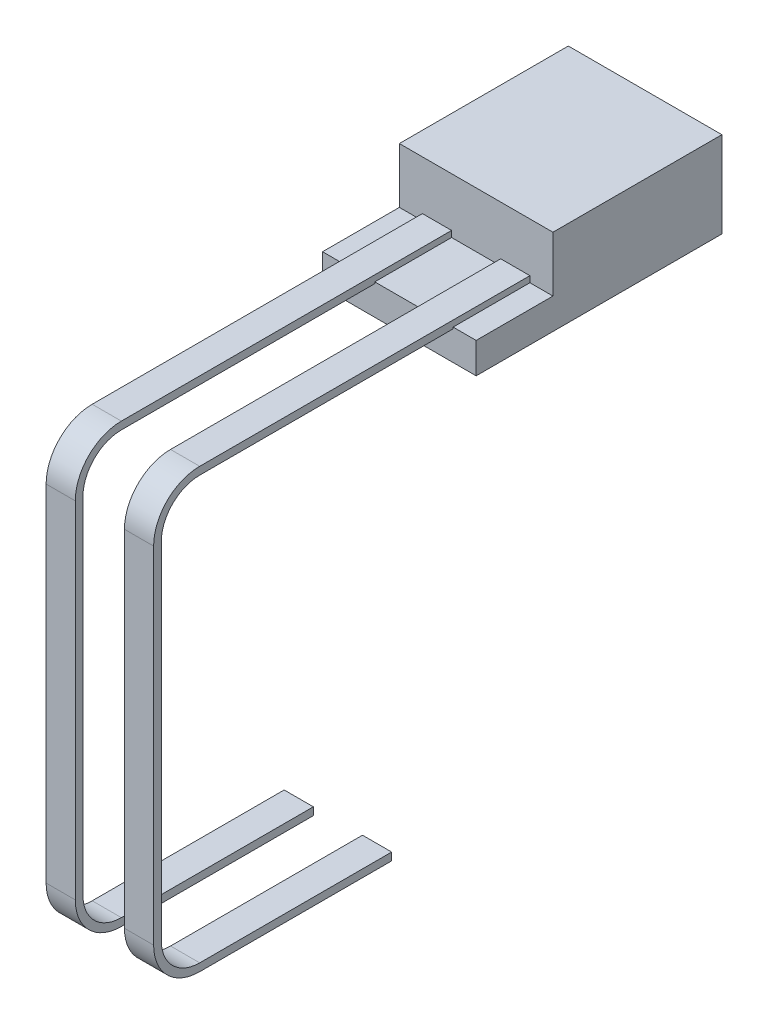
ISO-10303-21;
HEADER;
FILE_DESCRIPTION(('STEP AP214'),'2;1');
FILE_NAME('part.step','',(''),(''),'','','');
FILE_SCHEMA(('AUTOMOTIVE_DESIGN { 1 0 10303 214 1 1 1 1 }'));
ENDSEC;
DATA;
#1=APPLICATION_CONTEXT('core data for automotive mechanical design processes');
#2=APPLICATION_PROTOCOL_DEFINITION('international standard','automotive_design',2000,#1);
#3=PRODUCT_CONTEXT('',#1,'mechanical');
#4=PRODUCT('Part','Part','',(#3));
#5=PRODUCT_RELATED_PRODUCT_CATEGORY('part','',(#4));
#6=PRODUCT_DEFINITION_FORMATION('','',#4);
#7=PRODUCT_DEFINITION_CONTEXT('part definition',#1,'design');
#8=PRODUCT_DEFINITION('design','',#6,#7);
#9=PRODUCT_DEFINITION_SHAPE('','',#8);
#10=(LENGTH_UNIT() NAMED_UNIT(*) SI_UNIT(.MILLI.,.METRE.));
#11=(NAMED_UNIT(*) PLANE_ANGLE_UNIT() SI_UNIT($,.RADIAN.));
#12=(NAMED_UNIT(*) SI_UNIT($,.STERADIAN.) SOLID_ANGLE_UNIT());
#13=UNCERTAINTY_MEASURE_WITH_UNIT(LENGTH_MEASURE(1.E-05),#10,'distance_accuracy_value','');
#14=(GEOMETRIC_REPRESENTATION_CONTEXT(3) GLOBAL_UNCERTAINTY_ASSIGNED_CONTEXT((#13)) GLOBAL_UNIT_ASSIGNED_CONTEXT((#10,
#11,#12)) REPRESENTATION_CONTEXT('',''));
#15=CARTESIAN_POINT('',(0.,0.,0.));
#16=DIRECTION('',(0.,0.,1.));
#17=DIRECTION('',(1.,0.,0.));
#18=AXIS2_PLACEMENT_3D('',#15,#16,#17);
#19=CARTESIAN_POINT('',(-5.,0.4,3.63381681835357));
#20=DIRECTION('',(0.,-1.,0.));
#21=DIRECTION('',(0.,0.,-1.));
#22=AXIS2_PLACEMENT_3D('',#19,#20,#21);
#23=PLANE('',#22);
#24=DIRECTION('',(1.,0.,0.));
#25=VECTOR('',#24,1.);
#26=CARTESIAN_POINT('',(-5.,0.4,2.2));
#27=LINE('',#26,#25);
#28=CARTESIAN_POINT('',(-0.32,0.4,2.2));
#29=VERTEX_POINT('',#28);
#30=CARTESIAN_POINT('',(0.32,0.4,2.2));
#31=VERTEX_POINT('',#30);
#32=EDGE_CURVE('E486',#29,#31,#27,.T.);
#33=ORIENTED_EDGE('',*,*,#32,.F.);
#34=DIRECTION('',(0.,0.,1.));
#35=VECTOR('',#34,1.);
#36=CARTESIAN_POINT('',(-0.32,0.4,3.63381681835357));
#37=LINE('',#36,#35);
#38=CARTESIAN_POINT('',(-0.32,0.4,3.2));
#39=VERTEX_POINT('',#38);
#40=EDGE_CURVE('E362',#29,#39,#37,.T.);
#41=ORIENTED_EDGE('',*,*,#40,.T.);
#42=DIRECTION('',(-1.,0.,0.));
#43=VECTOR('',#42,1.);
#44=CARTESIAN_POINT('',(-1.,0.4,3.2));
#45=LINE('',#44,#43);
#46=CARTESIAN_POINT('',(0.32,0.4,3.2));
#47=VERTEX_POINT('',#46);
#48=EDGE_CURVE('E497',#47,#39,#45,.T.);
#49=ORIENTED_EDGE('',*,*,#48,.F.);
#50=DIRECTION('',(0.,0.,1.));
#51=VECTOR('',#50,1.);
#52=CARTESIAN_POINT('',(0.32,0.4,3.63381681835357));
#53=LINE('',#52,#51);
#54=EDGE_CURVE('E476',#31,#47,#53,.T.);
#55=ORIENTED_EDGE('',*,*,#54,.F.);
#56=EDGE_LOOP('',(#33,#41,#49,#55));
#57=FACE_BOUND('',#56,.T.);
#58=ADVANCED_FACE('F33',(#57),#23,.F.);
#59=CARTESIAN_POINT('',(-1.,1.12,3.2));
#60=DIRECTION('',(0.,0.,-1.));
#61=DIRECTION('',(-1.,0.,0.));
#62=AXIS2_PLACEMENT_3D('',#59,#60,#61);
#63=PLANE('',#62);
#64=ORIENTED_EDGE('',*,*,#48,.T.);
#65=DIRECTION('',(0.,-1.,0.));
#66=VECTOR('',#65,1.);
#67=CARTESIAN_POINT('',(-0.32,1.12,3.2));
#68=LINE('',#67,#66);
#69=CARTESIAN_POINT('',(-0.32,0.38,3.2));
#70=VERTEX_POINT('',#69);
#71=EDGE_CURVE('E365',#39,#70,#68,.T.);
#72=ORIENTED_EDGE('',*,*,#71,.T.);
#73=DIRECTION('',(-1.,0.,0.));
#74=VECTOR('',#73,1.);
#75=CARTESIAN_POINT('',(-1.,0.38,3.2));
#76=LINE('',#75,#74);
#77=CARTESIAN_POINT('',(-0.7,0.38,3.2));
#78=VERTEX_POINT('',#77);
#79=EDGE_CURVE('E11',#70,#78,#76,.T.);
#80=ORIENTED_EDGE('',*,*,#79,.T.);
#81=DIRECTION('',(0.,1.,0.));
#82=VECTOR('',#81,1.);
#83=CARTESIAN_POINT('',(-0.7,1.12,3.2));
#84=LINE('',#83,#82);
#85=CARTESIAN_POINT('',(-0.7,0.4,3.2));
#86=VERTEX_POINT('',#85);
#87=EDGE_CURVE('E359',#78,#86,#84,.T.);
#88=ORIENTED_EDGE('',*,*,#87,.T.);
#89=CARTESIAN_POINT('',(-1.,0.4,3.2));
#90=VERTEX_POINT('',#89);
#91=EDGE_CURVE('E492',#86,#90,#45,.T.);
#92=ORIENTED_EDGE('',*,*,#91,.T.);
#93=DIRECTION('',(0.,-1.,0.));
#94=VECTOR('',#93,1.);
#95=CARTESIAN_POINT('',(-1.,1.12,3.2));
#96=LINE('',#95,#94);
#97=CARTESIAN_POINT('',(-1.,0.,3.2));
#98=VERTEX_POINT('',#97);
#99=EDGE_CURVE('E525',#90,#98,#96,.T.);
#100=ORIENTED_EDGE('',*,*,#99,.T.);
#101=DIRECTION('',(1.,0.,0.));
#102=VECTOR('',#101,1.);
#103=CARTESIAN_POINT('',(-1.,0.,3.2));
#104=LINE('',#103,#102);
#105=CARTESIAN_POINT('',(1.,0.,3.2));
#106=VERTEX_POINT('',#105);
#107=EDGE_CURVE('E512',#98,#106,#104,.T.);
#108=ORIENTED_EDGE('',*,*,#107,.T.);
#109=DIRECTION('',(0.,-1.,0.));
#110=VECTOR('',#109,1.);
#111=CARTESIAN_POINT('',(1.,1.12,3.2));
#112=LINE('',#111,#110);
#113=CARTESIAN_POINT('',(1.,0.4,3.2));
#114=VERTEX_POINT('',#113);
#115=EDGE_CURVE('E523',#114,#106,#112,.T.);
#116=ORIENTED_EDGE('',*,*,#115,.F.);
#117=CARTESIAN_POINT('',(0.7,0.4,3.2));
#118=VERTEX_POINT('',#117);
#119=EDGE_CURVE('E493',#114,#118,#45,.T.);
#120=ORIENTED_EDGE('',*,*,#119,.T.);
#121=DIRECTION('',(0.,1.,0.));
#122=VECTOR('',#121,1.);
#123=CARTESIAN_POINT('',(0.7,1.12,3.2));
#124=LINE('',#123,#122);
#125=CARTESIAN_POINT('',(0.7,0.38,3.2));
#126=VERTEX_POINT('',#125);
#127=EDGE_CURVE('E473',#126,#118,#124,.T.);
#128=ORIENTED_EDGE('',*,*,#127,.F.);
#129=DIRECTION('',(1.,0.,0.));
#130=VECTOR('',#129,1.);
#131=CARTESIAN_POINT('',(-1.,0.38,3.2));
#132=LINE('',#131,#130);
#133=CARTESIAN_POINT('',(0.32,0.38,3.2));
#134=VERTEX_POINT('',#133);
#135=EDGE_CURVE('E56',#134,#126,#132,.T.);
#136=ORIENTED_EDGE('',*,*,#135,.F.);
#137=DIRECTION('',(0.,-1.,0.));
#138=VECTOR('',#137,1.);
#139=CARTESIAN_POINT('',(0.32,1.12,3.2));
#140=LINE('',#139,#138);
#141=EDGE_CURVE('E479',#47,#134,#140,.T.);
#142=ORIENTED_EDGE('',*,*,#141,.F.);
#143=EDGE_LOOP('',(#64,#72,#80,#88,#92,#100,#108,#116,#120,#128,#136,#142));
#144=FACE_BOUND('',#143,.T.);
#145=ADVANCED_FACE('F548',(#144),#63,.F.);
#146=ORIENTED_EDGE('',*,*,#91,.F.);
#147=DIRECTION('',(0.,0.,-1.));
#148=VECTOR('',#147,1.);
#149=CARTESIAN_POINT('',(-0.7,0.4,3.63381681835357));
#150=LINE('',#149,#148);
#151=CARTESIAN_POINT('',(-0.7,0.4,2.2));
#152=VERTEX_POINT('',#151);
#153=EDGE_CURVE('E356',#86,#152,#150,.T.);
#154=ORIENTED_EDGE('',*,*,#153,.T.);
#155=CARTESIAN_POINT('',(-1.,0.4,2.2));
#156=VERTEX_POINT('',#155);
#157=EDGE_CURVE('E482',#156,#152,#27,.T.);
#158=ORIENTED_EDGE('',*,*,#157,.F.);
#159=DIRECTION('',(0.,0.,-1.));
#160=VECTOR('',#159,1.);
#161=CARTESIAN_POINT('',(-1.,0.4,0.));
#162=LINE('',#161,#160);
#163=EDGE_CURVE('E496',#90,#156,#162,.T.);
#164=ORIENTED_EDGE('',*,*,#163,.F.);
#165=EDGE_LOOP('',(#146,#154,#158,#164));
#166=FACE_BOUND('',#165,.T.);
#167=ADVANCED_FACE('F543',(#166),#23,.F.);
#168=DIRECTION('',(0.,0.,-1.));
#169=VECTOR('',#168,1.);
#170=CARTESIAN_POINT('',(0.7,0.4,3.63381681835357));
#171=LINE('',#170,#169);
#172=CARTESIAN_POINT('',(0.7,0.4,2.2));
#173=VERTEX_POINT('',#172);
#174=EDGE_CURVE('E470',#118,#173,#171,.T.);
#175=ORIENTED_EDGE('',*,*,#174,.F.);
#176=ORIENTED_EDGE('',*,*,#119,.F.);
#177=DIRECTION('',(0.,0.,1.));
#178=VECTOR('',#177,1.);
#179=CARTESIAN_POINT('',(1.,0.4,0.));
#180=LINE('',#179,#178);
#181=CARTESIAN_POINT('',(1.,0.4,2.2));
#182=VERTEX_POINT('',#181);
#183=EDGE_CURVE('E529',#182,#114,#180,.T.);
#184=ORIENTED_EDGE('',*,*,#183,.F.);
#185=EDGE_CURVE('E481',#173,#182,#27,.T.);
#186=ORIENTED_EDGE('',*,*,#185,.F.);
#187=EDGE_LOOP('',(#175,#176,#184,#186));
#188=FACE_BOUND('',#187,.T.);
#189=ADVANCED_FACE('F565',(#188),#23,.F.);
#190=CARTESIAN_POINT('',(-5.,1.46500542852974,2.2));
#191=DIRECTION('',(0.,0.,-1.));
#192=DIRECTION('',(-1.,0.,0.));
#193=AXIS2_PLACEMENT_3D('',#190,#191,#192);
#194=PLANE('',#193);
#195=DIRECTION('',(1.,0.,0.));
#196=VECTOR('',#195,1.);
#197=CARTESIAN_POINT('',(-0.32,0.48,2.2));
#198=LINE('',#197,#196);
#199=CARTESIAN_POINT('',(-0.7,0.48,2.2));
#200=VERTEX_POINT('',#199);
#201=CARTESIAN_POINT('',(-0.32,0.48,2.2));
#202=VERTEX_POINT('',#201);
#203=EDGE_CURVE('E48',#200,#202,#198,.T.);
#204=ORIENTED_EDGE('',*,*,#203,.T.);
#205=DIRECTION('',(0.,-1.,0.));
#206=VECTOR('',#205,1.);
#207=CARTESIAN_POINT('',(-0.32,0.48,2.2));
#208=LINE('',#207,#206);
#209=EDGE_CURVE('E273',#202,#29,#208,.T.);
#210=ORIENTED_EDGE('',*,*,#209,.T.);
#211=ORIENTED_EDGE('',*,*,#32,.T.);
#212=DIRECTION('',(0.,-1.,0.));
#213=VECTOR('',#212,1.);
#214=CARTESIAN_POINT('',(0.32,0.48,2.2));
#215=LINE('',#214,#213);
#216=CARTESIAN_POINT('',(0.32,0.48,2.2));
#217=VERTEX_POINT('',#216);
#218=EDGE_CURVE('E368',#217,#31,#215,.T.);
#219=ORIENTED_EDGE('',*,*,#218,.F.);
#220=DIRECTION('',(-1.,0.,0.));
#221=VECTOR('',#220,1.);
#222=CARTESIAN_POINT('',(0.32,0.48,2.2));
#223=LINE('',#222,#221);
#224=CARTESIAN_POINT('',(0.7,0.48,2.2));
#225=VERTEX_POINT('',#224);
#226=EDGE_CURVE('E373',#225,#217,#223,.T.);
#227=ORIENTED_EDGE('',*,*,#226,.F.);
#228=DIRECTION('',(0.,1.,0.));
#229=VECTOR('',#228,1.);
#230=CARTESIAN_POINT('',(0.7,1.46500542852974,2.2));
#231=LINE('',#230,#229);
#232=EDGE_CURVE('E532',#173,#225,#231,.T.);
#233=ORIENTED_EDGE('',*,*,#232,.F.);
#234=ORIENTED_EDGE('',*,*,#185,.T.);
#235=DIRECTION('',(0.,-1.,0.));
#236=VECTOR('',#235,1.);
#237=CARTESIAN_POINT('',(1.,1.12,2.2));
#238=LINE('',#237,#236);
#239=CARTESIAN_POINT('',(1.,1.12,2.2));
#240=VERTEX_POINT('',#239);
#241=EDGE_CURVE('E485',#240,#182,#238,.T.);
#242=ORIENTED_EDGE('',*,*,#241,.F.);
#243=DIRECTION('',(-1.,0.,0.));
#244=VECTOR('',#243,1.);
#245=CARTESIAN_POINT('',(-1.,1.12,2.2));
#246=LINE('',#245,#244);
#247=CARTESIAN_POINT('',(-1.,1.12,2.2));
#248=VERTEX_POINT('',#247);
#249=EDGE_CURVE('E527',#240,#248,#246,.T.);
#250=ORIENTED_EDGE('',*,*,#249,.T.);
#251=DIRECTION('',(0.,1.,0.));
#252=VECTOR('',#251,1.);
#253=CARTESIAN_POINT('',(-1.,1.12,2.2));
#254=LINE('',#253,#252);
#255=EDGE_CURVE('E489',#156,#248,#254,.T.);
#256=ORIENTED_EDGE('',*,*,#255,.F.);
#257=ORIENTED_EDGE('',*,*,#157,.T.);
#258=DIRECTION('',(0.,1.,0.));
#259=VECTOR('',#258,1.);
#260=CARTESIAN_POINT('',(-0.7,1.46500542852974,2.2));
#261=LINE('',#260,#259);
#262=EDGE_CURVE('E41',#152,#200,#261,.T.);
#263=ORIENTED_EDGE('',*,*,#262,.T.);
#264=EDGE_LOOP('',(#204,#210,#211,#219,#227,#233,#234,#242,#250,#256,#257,#263));
#265=FACE_BOUND('',#264,.T.);
#266=ADVANCED_FACE('F537',(#265),#194,.F.);
#267=CARTESIAN_POINT('',(-1.,1.12,0.));
#268=DIRECTION('',(1.,0.,0.));
#269=DIRECTION('',(0.,0.,-1.));
#270=AXIS2_PLACEMENT_3D('',#267,#268,#269);
#271=PLANE('',#270);
#272=ORIENTED_EDGE('',*,*,#163,.T.);
#273=ORIENTED_EDGE('',*,*,#255,.T.);
#274=DIRECTION('',(0.,0.,1.));
#275=VECTOR('',#274,1.);
#276=CARTESIAN_POINT('',(-1.,1.12,0.));
#277=LINE('',#276,#275);
#278=CARTESIAN_POINT('',(-1.,1.12,0.));
#279=VERTEX_POINT('',#278);
#280=EDGE_CURVE('E501',#279,#248,#277,.T.);
#281=ORIENTED_EDGE('',*,*,#280,.F.);
#282=DIRECTION('',(0.,-1.,0.));
#283=VECTOR('',#282,1.);
#284=CARTESIAN_POINT('',(-1.,1.12,0.));
#285=LINE('',#284,#283);
#286=CARTESIAN_POINT('',(-1.,0.,0.));
#287=VERTEX_POINT('',#286);
#288=EDGE_CURVE('E509',#279,#287,#285,.T.);
#289=ORIENTED_EDGE('',*,*,#288,.T.);
#290=DIRECTION('',(0.,0.,1.));
#291=VECTOR('',#290,1.);
#292=CARTESIAN_POINT('',(-1.,0.,0.));
#293=LINE('',#292,#291);
#294=EDGE_CURVE('E500',#287,#98,#293,.T.);
#295=ORIENTED_EDGE('',*,*,#294,.T.);
#296=ORIENTED_EDGE('',*,*,#99,.F.);
#297=EDGE_LOOP('',(#272,#273,#281,#289,#295,#296));
#298=FACE_BOUND('',#297,.T.);
#299=ADVANCED_FACE('F35',(#298),#271,.F.);
#300=CARTESIAN_POINT('',(1.,1.12,0.));
#301=DIRECTION('',(-1.,0.,0.));
#302=DIRECTION('',(0.,0.,1.));
#303=AXIS2_PLACEMENT_3D('',#300,#301,#302);
#304=PLANE('',#303);
#305=DIRECTION('',(0.,0.,-1.));
#306=VECTOR('',#305,1.);
#307=CARTESIAN_POINT('',(1.,1.12,0.));
#308=LINE('',#307,#306);
#309=CARTESIAN_POINT('',(1.,1.12,0.));
#310=VERTEX_POINT('',#309);
#311=EDGE_CURVE('E504',#240,#310,#308,.T.);
#312=ORIENTED_EDGE('',*,*,#311,.F.);
#313=ORIENTED_EDGE('',*,*,#241,.T.);
#314=ORIENTED_EDGE('',*,*,#183,.T.);
#315=ORIENTED_EDGE('',*,*,#115,.T.);
#316=DIRECTION('',(0.,0.,-1.));
#317=VECTOR('',#316,1.);
#318=CARTESIAN_POINT('',(1.,0.,0.));
#319=LINE('',#318,#317);
#320=CARTESIAN_POINT('',(1.,0.,0.));
#321=VERTEX_POINT('',#320);
#322=EDGE_CURVE('E515',#106,#321,#319,.T.);
#323=ORIENTED_EDGE('',*,*,#322,.T.);
#324=DIRECTION('',(0.,-1.,0.));
#325=VECTOR('',#324,1.);
#326=CARTESIAN_POINT('',(1.,1.12,0.));
#327=LINE('',#326,#325);
#328=EDGE_CURVE('E520',#310,#321,#327,.T.);
#329=ORIENTED_EDGE('',*,*,#328,.F.);
#330=EDGE_LOOP('',(#312,#313,#314,#315,#323,#329));
#331=FACE_BOUND('',#330,.T.);
#332=ADVANCED_FACE('F569',(#331),#304,.F.);
#333=CARTESIAN_POINT('',(-1.,1.12,0.));
#334=DIRECTION('',(0.,0.,1.));
#335=DIRECTION('',(1.,0.,0.));
#336=AXIS2_PLACEMENT_3D('',#333,#334,#335);
#337=PLANE('',#336);
#338=DIRECTION('',(-1.,0.,0.));
#339=VECTOR('',#338,1.);
#340=CARTESIAN_POINT('',(-1.,0.,0.));
#341=LINE('',#340,#339);
#342=EDGE_CURVE('E505',#321,#287,#341,.T.);
#343=ORIENTED_EDGE('',*,*,#342,.T.);
#344=ORIENTED_EDGE('',*,*,#288,.F.);
#345=DIRECTION('',(-1.,0.,0.));
#346=VECTOR('',#345,1.);
#347=CARTESIAN_POINT('',(-1.,1.12,0.));
#348=LINE('',#347,#346);
#349=EDGE_CURVE('E507',#310,#279,#348,.T.);
#350=ORIENTED_EDGE('',*,*,#349,.F.);
#351=ORIENTED_EDGE('',*,*,#328,.T.);
#352=EDGE_LOOP('',(#343,#344,#350,#351));
#353=FACE_BOUND('',#352,.T.);
#354=ADVANCED_FACE('F585',(#353),#337,.F.);
#355=CARTESIAN_POINT('',(-1.,1.12,3.2));
#356=DIRECTION('',(0.,1.,0.));
#357=DIRECTION('',(0.,0.,1.));
#358=AXIS2_PLACEMENT_3D('',#355,#356,#357);
#359=PLANE('',#358);
#360=ORIENTED_EDGE('',*,*,#249,.F.);
#361=ORIENTED_EDGE('',*,*,#311,.T.);
#362=ORIENTED_EDGE('',*,*,#349,.T.);
#363=ORIENTED_EDGE('',*,*,#280,.T.);
#364=EDGE_LOOP('',(#360,#361,#362,#363));
#365=FACE_BOUND('',#364,.T.);
#366=ADVANCED_FACE('F573',(#365),#359,.T.);
#367=CARTESIAN_POINT('',(-1.,0.,3.2));
#368=DIRECTION('',(0.,1.,0.));
#369=DIRECTION('',(0.,0.,1.));
#370=AXIS2_PLACEMENT_3D('',#367,#368,#369);
#371=PLANE('',#370);
#372=ORIENTED_EDGE('',*,*,#294,.F.);
#373=ORIENTED_EDGE('',*,*,#342,.F.);
#374=ORIENTED_EDGE('',*,*,#322,.F.);
#375=ORIENTED_EDGE('',*,*,#107,.F.);
#376=EDGE_LOOP('',(#372,#373,#374,#375));
#377=FACE_BOUND('',#376,.T.);
#378=ADVANCED_FACE('F582',(#377),#371,.F.);
#379=CARTESIAN_POINT('',(0.32,0.38,6.5));
#380=DIRECTION('',(0.,1.,0.));
#381=DIRECTION('',(0.,0.,1.));
#382=AXIS2_PLACEMENT_3D('',#379,#380,#381);
#383=PLANE('',#382);
#384=DIRECTION('',(0.,0.,-1.));
#385=VECTOR('',#384,1.);
#386=CARTESIAN_POINT('',(0.32,0.38,6.5));
#387=LINE('',#386,#385);
#388=CARTESIAN_POINT('',(0.32,0.38,6.5));
#389=VERTEX_POINT('',#388);
#390=EDGE_CURVE('E389',#389,#134,#387,.T.);
#391=ORIENTED_EDGE('',*,*,#390,.T.);
#392=ORIENTED_EDGE('',*,*,#135,.T.);
#393=DIRECTION('',(0.,0.,-1.));
#394=VECTOR('',#393,1.);
#395=CARTESIAN_POINT('',(0.7,0.38,6.5));
#396=LINE('',#395,#394);
#397=CARTESIAN_POINT('',(0.7,0.38,6.5));
#398=VERTEX_POINT('',#397);
#399=EDGE_CURVE('E386',#398,#126,#396,.T.);
#400=ORIENTED_EDGE('',*,*,#399,.F.);
#401=DIRECTION('',(1.,0.,0.));
#402=VECTOR('',#401,1.);
#403=CARTESIAN_POINT('',(0.32,0.38,6.5));
#404=LINE('',#403,#402);
#405=EDGE_CURVE('E369',#389,#398,#404,.T.);
#406=ORIENTED_EDGE('',*,*,#405,.F.);
#407=EDGE_LOOP('',(#391,#392,#400,#406));
#408=FACE_BOUND('',#407,.T.);
#409=ADVANCED_FACE('F643',(#408),#383,.F.);
#410=CARTESIAN_POINT('',(0.32,0.48,6.5));
#411=DIRECTION('',(1.,0.,0.));
#412=DIRECTION('',(0.,0.,-1.));
#413=AXIS2_PLACEMENT_3D('',#410,#411,#412);
#414=PLANE('',#413);
#415=ORIENTED_EDGE('',*,*,#54,.T.);
#416=ORIENTED_EDGE('',*,*,#141,.T.);
#417=ORIENTED_EDGE('',*,*,#390,.F.);
#418=CARTESIAN_POINT('',(0.32,-0.12,6.5));
#419=DIRECTION('',(1.,0.,0.));
#420=DIRECTION('',(0.,0.,-1.));
#421=AXIS2_PLACEMENT_3D('',#418,#419,#420);
#422=CIRCLE('',#421,0.5);
#423=CARTESIAN_POINT('',(0.32,-0.12,7.));
#424=VERTEX_POINT('',#423);
#425=EDGE_CURVE('E407',#389,#424,#422,.T.);
#426=ORIENTED_EDGE('',*,*,#425,.T.);
#427=DIRECTION('',(0.,-1.,0.));
#428=VECTOR('',#427,1.);
#429=CARTESIAN_POINT('',(0.32,-0.12,7.));
#430=LINE('',#429,#428);
#431=CARTESIAN_POINT('',(0.319999999999999,-4.62,7.));
#432=VERTEX_POINT('',#431);
#433=EDGE_CURVE('E425',#424,#432,#430,.T.);
#434=ORIENTED_EDGE('',*,*,#433,.T.);
#435=CARTESIAN_POINT('',(0.319999999999999,-4.62,6.5));
#436=DIRECTION('',(1.,0.,0.));
#437=DIRECTION('',(0.,0.,-1.));
#438=AXIS2_PLACEMENT_3D('',#435,#436,#437);
#439=CIRCLE('',#438,0.5);
#440=CARTESIAN_POINT('',(0.319999999999999,-5.12,6.5));
#441=VERTEX_POINT('',#440);
#442=EDGE_CURVE('E443',#432,#441,#439,.T.);
#443=ORIENTED_EDGE('',*,*,#442,.T.);
#444=DIRECTION('',(0.,0.,-1.));
#445=VECTOR('',#444,1.);
#446=CARTESIAN_POINT('',(0.319999999999999,-5.12,6.5));
#447=LINE('',#446,#445);
#448=CARTESIAN_POINT('',(0.319999999999999,-5.12,4.));
#449=VERTEX_POINT('',#448);
#450=EDGE_CURVE('E467',#441,#449,#447,.T.);
#451=ORIENTED_EDGE('',*,*,#450,.T.);
#452=DIRECTION('',(0.,1.,0.));
#453=VECTOR('',#452,1.);
#454=CARTESIAN_POINT('',(0.319999999999999,-5.22,4.));
#455=LINE('',#454,#453);
#456=CARTESIAN_POINT('',(0.319999999999999,-5.22,4.));
#457=VERTEX_POINT('',#456);
#458=EDGE_CURVE('E446',#457,#449,#455,.T.);
#459=ORIENTED_EDGE('',*,*,#458,.F.);
#460=DIRECTION('',(0.,0.,-1.));
#461=VECTOR('',#460,1.);
#462=CARTESIAN_POINT('',(0.319999999999999,-5.22,6.5));
#463=LINE('',#462,#461);
#464=CARTESIAN_POINT('',(0.319999999999999,-5.22,6.5));
#465=VERTEX_POINT('',#464);
#466=EDGE_CURVE('E458',#465,#457,#463,.T.);
#467=ORIENTED_EDGE('',*,*,#466,.F.);
#468=CARTESIAN_POINT('',(0.319999999999999,-4.62,6.5));
#469=DIRECTION('',(1.,0.,0.));
#470=DIRECTION('',(0.,0.,-1.));
#471=AXIS2_PLACEMENT_3D('',#468,#469,#470);
#472=CIRCLE('',#471,0.6);
#473=CARTESIAN_POINT('',(0.319999999999999,-4.62,7.1));
#474=VERTEX_POINT('',#473);
#475=EDGE_CURVE('E434',#474,#465,#472,.T.);
#476=ORIENTED_EDGE('',*,*,#475,.F.);
#477=DIRECTION('',(0.,-1.,0.));
#478=VECTOR('',#477,1.);
#479=CARTESIAN_POINT('',(0.32,-0.12,7.1));
#480=LINE('',#479,#478);
#481=CARTESIAN_POINT('',(0.32,-0.12,7.1));
#482=VERTEX_POINT('',#481);
#483=EDGE_CURVE('E416',#482,#474,#480,.T.);
#484=ORIENTED_EDGE('',*,*,#483,.F.);
#485=CARTESIAN_POINT('',(0.32,-0.12,6.5));
#486=DIRECTION('',(1.,0.,0.));
#487=DIRECTION('',(0.,0.,-1.));
#488=AXIS2_PLACEMENT_3D('',#485,#486,#487);
#489=CIRCLE('',#488,0.6);
#490=CARTESIAN_POINT('',(0.32,0.48,6.5));
#491=VERTEX_POINT('',#490);
#492=EDGE_CURVE('E398',#491,#482,#489,.T.);
#493=ORIENTED_EDGE('',*,*,#492,.F.);
#494=DIRECTION('',(0.,0.,-1.));
#495=VECTOR('',#494,1.);
#496=CARTESIAN_POINT('',(0.32,0.48,6.5));
#497=LINE('',#496,#495);
#498=EDGE_CURVE('E376',#491,#217,#497,.T.);
#499=ORIENTED_EDGE('',*,*,#498,.T.);
#500=ORIENTED_EDGE('',*,*,#218,.T.);
#501=EDGE_LOOP('',(#415,#416,#417,#426,#434,#443,#451,#459,#467,#476,#484,#493,#499,#500));
#502=FACE_BOUND('',#501,.T.);
#503=ADVANCED_FACE('F553',(#502),#414,.F.);
#504=CARTESIAN_POINT('',(0.7,0.48,6.5));
#505=DIRECTION('',(-1.,0.,0.));
#506=DIRECTION('',(0.,0.,1.));
#507=AXIS2_PLACEMENT_3D('',#504,#505,#506);
#508=PLANE('',#507);
#509=ORIENTED_EDGE('',*,*,#399,.T.);
#510=ORIENTED_EDGE('',*,*,#127,.T.);
#511=ORIENTED_EDGE('',*,*,#174,.T.);
#512=ORIENTED_EDGE('',*,*,#232,.T.);
#513=DIRECTION('',(0.,0.,-1.));
#514=VECTOR('',#513,1.);
#515=CARTESIAN_POINT('',(0.7,0.48,6.5));
#516=LINE('',#515,#514);
#517=CARTESIAN_POINT('',(0.7,0.48,6.5));
#518=VERTEX_POINT('',#517);
#519=EDGE_CURVE('E383',#518,#225,#516,.T.);
#520=ORIENTED_EDGE('',*,*,#519,.F.);
#521=CARTESIAN_POINT('',(0.7,-0.12,6.5));
#522=DIRECTION('',(1.,0.,0.));
#523=DIRECTION('',(0.,0.,-1.));
#524=AXIS2_PLACEMENT_3D('',#521,#522,#523);
#525=CIRCLE('',#524,0.6);
#526=CARTESIAN_POINT('',(0.7,-0.12,7.1));
#527=VERTEX_POINT('',#526);
#528=EDGE_CURVE('E401',#518,#527,#525,.T.);
#529=ORIENTED_EDGE('',*,*,#528,.T.);
#530=DIRECTION('',(0.,-1.,0.));
#531=VECTOR('',#530,1.);
#532=CARTESIAN_POINT('',(0.7,-0.12,7.1));
#533=LINE('',#532,#531);
#534=CARTESIAN_POINT('',(0.699999999999999,-4.62,7.1));
#535=VERTEX_POINT('',#534);
#536=EDGE_CURVE('E419',#527,#535,#533,.T.);
#537=ORIENTED_EDGE('',*,*,#536,.T.);
#538=CARTESIAN_POINT('',(0.699999999999999,-4.62,6.5));
#539=DIRECTION('',(1.,0.,0.));
#540=DIRECTION('',(0.,0.,-1.));
#541=AXIS2_PLACEMENT_3D('',#538,#539,#540);
#542=CIRCLE('',#541,0.6);
#543=CARTESIAN_POINT('',(0.699999999999999,-5.22,6.5));
#544=VERTEX_POINT('',#543);
#545=EDGE_CURVE('E437',#535,#544,#542,.T.);
#546=ORIENTED_EDGE('',*,*,#545,.T.);
#547=DIRECTION('',(0.,0.,-1.));
#548=VECTOR('',#547,1.);
#549=CARTESIAN_POINT('',(0.699999999999999,-5.22,6.5));
#550=LINE('',#549,#548);
#551=CARTESIAN_POINT('',(0.699999999999999,-5.22,4.));
#552=VERTEX_POINT('',#551);
#553=EDGE_CURVE('E461',#544,#552,#550,.T.);
#554=ORIENTED_EDGE('',*,*,#553,.T.);
#555=DIRECTION('',(0.,-1.,0.));
#556=VECTOR('',#555,1.);
#557=CARTESIAN_POINT('',(0.699999999999999,-5.22,4.));
#558=LINE('',#557,#556);
#559=CARTESIAN_POINT('',(0.699999999999999,-5.12,4.));
#560=VERTEX_POINT('',#559);
#561=EDGE_CURVE('E452',#560,#552,#558,.T.);
#562=ORIENTED_EDGE('',*,*,#561,.F.);
#563=DIRECTION('',(0.,0.,-1.));
#564=VECTOR('',#563,1.);
#565=CARTESIAN_POINT('',(0.699999999999999,-5.12,6.5));
#566=LINE('',#565,#564);
#567=CARTESIAN_POINT('',(0.699999999999999,-5.12,6.5));
#568=VERTEX_POINT('',#567);
#569=EDGE_CURVE('E464',#568,#560,#566,.T.);
#570=ORIENTED_EDGE('',*,*,#569,.F.);
#571=CARTESIAN_POINT('',(0.699999999999999,-4.62,6.5));
#572=DIRECTION('',(1.,0.,0.));
#573=DIRECTION('',(0.,0.,-1.));
#574=AXIS2_PLACEMENT_3D('',#571,#572,#573);
#575=CIRCLE('',#574,0.5);
#576=CARTESIAN_POINT('',(0.699999999999999,-4.62,7.));
#577=VERTEX_POINT('',#576);
#578=EDGE_CURVE('E440',#577,#568,#575,.T.);
#579=ORIENTED_EDGE('',*,*,#578,.F.);
#580=DIRECTION('',(0.,-1.,0.));
#581=VECTOR('',#580,1.);
#582=CARTESIAN_POINT('',(0.7,-0.12,7.));
#583=LINE('',#582,#581);
#584=CARTESIAN_POINT('',(0.7,-0.12,7.));
#585=VERTEX_POINT('',#584);
#586=EDGE_CURVE('E422',#585,#577,#583,.T.);
#587=ORIENTED_EDGE('',*,*,#586,.F.);
#588=CARTESIAN_POINT('',(0.7,-0.12,6.5));
#589=DIRECTION('',(1.,0.,0.));
#590=DIRECTION('',(0.,0.,-1.));
#591=AXIS2_PLACEMENT_3D('',#588,#589,#590);
#592=CIRCLE('',#591,0.5);
#593=EDGE_CURVE('E404',#398,#585,#592,.T.);
#594=ORIENTED_EDGE('',*,*,#593,.F.);
#595=EDGE_LOOP('',(#509,#510,#511,#512,#520,#529,#537,#546,#554,#562,#570,#579,#587,#594));
#596=FACE_BOUND('',#595,.T.);
#597=ADVANCED_FACE('F561',(#596),#508,.F.);
#598=CARTESIAN_POINT('',(0.319999999999999,-5.12,6.5));
#599=DIRECTION('',(0.,1.,0.));
#600=DIRECTION('',(0.,0.,1.));
#601=AXIS2_PLACEMENT_3D('',#598,#599,#600);
#602=PLANE('',#601);
#603=DIRECTION('',(1.,0.,0.));
#604=VECTOR('',#603,1.);
#605=CARTESIAN_POINT('',(0.319999999999999,-5.12,6.5));
#606=LINE('',#605,#604);
#607=EDGE_CURVE('E431',#441,#568,#606,.T.);
#608=ORIENTED_EDGE('',*,*,#607,.T.);
#609=ORIENTED_EDGE('',*,*,#569,.T.);
#610=DIRECTION('',(1.,0.,0.));
#611=VECTOR('',#610,1.);
#612=CARTESIAN_POINT('',(0.319999999999999,-5.12,4.));
#613=LINE('',#612,#611);
#614=EDGE_CURVE('E455',#449,#560,#613,.T.);
#615=ORIENTED_EDGE('',*,*,#614,.F.);
#616=ORIENTED_EDGE('',*,*,#450,.F.);
#617=EDGE_LOOP('',(#608,#609,#615,#616));
#618=FACE_BOUND('',#617,.T.);
#619=ADVANCED_FACE('F660',(#618),#602,.T.);
#620=CARTESIAN_POINT('',(0.319999999999999,-5.22,6.5));
#621=DIRECTION('',(0.,-1.,0.));
#622=DIRECTION('',(0.,0.,-1.));
#623=AXIS2_PLACEMENT_3D('',#620,#621,#622);
#624=PLANE('',#623);
#625=DIRECTION('',(-1.,0.,0.));
#626=VECTOR('',#625,1.);
#627=CARTESIAN_POINT('',(0.319999999999999,-5.22,6.5));
#628=LINE('',#627,#626);
#629=EDGE_CURVE('E428',#544,#465,#628,.T.);
#630=ORIENTED_EDGE('',*,*,#629,.T.);
#631=ORIENTED_EDGE('',*,*,#466,.T.);
#632=DIRECTION('',(-1.,0.,0.));
#633=VECTOR('',#632,1.);
#634=CARTESIAN_POINT('',(0.319999999999999,-5.22,4.));
#635=LINE('',#634,#633);
#636=EDGE_CURVE('E449',#552,#457,#635,.T.);
#637=ORIENTED_EDGE('',*,*,#636,.F.);
#638=ORIENTED_EDGE('',*,*,#553,.F.);
#639=EDGE_LOOP('',(#630,#631,#637,#638));
#640=FACE_BOUND('',#639,.T.);
#641=ADVANCED_FACE('F667',(#640),#624,.T.);
#642=CARTESIAN_POINT('',(0.509999999999999,-4.62,6.5));
#643=DIRECTION('',(1.,0.,0.));
#644=DIRECTION('',(0.,0.,-1.));
#645=AXIS2_PLACEMENT_3D('',#642,#643,#644);
#646=CYLINDRICAL_SURFACE('',#645,0.5);
#647=DIRECTION('',(1.,0.,0.));
#648=VECTOR('',#647,1.);
#649=CARTESIAN_POINT('',(0.319999999999999,-4.62,7.));
#650=LINE('',#649,#648);
#651=EDGE_CURVE('E413',#432,#577,#650,.T.);
#652=ORIENTED_EDGE('',*,*,#651,.T.);
#653=ORIENTED_EDGE('',*,*,#578,.T.);
#654=ORIENTED_EDGE('',*,*,#607,.F.);
#655=ORIENTED_EDGE('',*,*,#442,.F.);
#656=EDGE_LOOP('',(#652,#653,#654,#655));
#657=FACE_BOUND('',#656,.T.);
#658=ADVANCED_FACE('F675',(#657),#646,.F.);
#659=CARTESIAN_POINT('',(0.509999999999999,-4.62,6.5));
#660=DIRECTION('',(1.,0.,0.));
#661=DIRECTION('',(0.,0.,-1.));
#662=AXIS2_PLACEMENT_3D('',#659,#660,#661);
#663=CYLINDRICAL_SURFACE('',#662,0.6);
#664=DIRECTION('',(-1.,0.,0.));
#665=VECTOR('',#664,1.);
#666=CARTESIAN_POINT('',(0.319999999999999,-4.62,7.1));
#667=LINE('',#666,#665);
#668=EDGE_CURVE('E410',#535,#474,#667,.T.);
#669=ORIENTED_EDGE('',*,*,#668,.T.);
#670=ORIENTED_EDGE('',*,*,#475,.T.);
#671=ORIENTED_EDGE('',*,*,#629,.F.);
#672=ORIENTED_EDGE('',*,*,#545,.F.);
#673=EDGE_LOOP('',(#669,#670,#671,#672));
#674=FACE_BOUND('',#673,.T.);
#675=ADVANCED_FACE('F683',(#674),#663,.T.);
#676=CARTESIAN_POINT('',(0.32,-0.12,7.));
#677=DIRECTION('',(0.,0.,-1.));
#678=DIRECTION('',(-1.,0.,0.));
#679=AXIS2_PLACEMENT_3D('',#676,#677,#678);
#680=PLANE('',#679);
#681=DIRECTION('',(1.,0.,0.));
#682=VECTOR('',#681,1.);
#683=CARTESIAN_POINT('',(0.32,-0.12,7.));
#684=LINE('',#683,#682);
#685=EDGE_CURVE('E395',#424,#585,#684,.T.);
#686=ORIENTED_EDGE('',*,*,#685,.T.);
#687=ORIENTED_EDGE('',*,*,#586,.T.);
#688=ORIENTED_EDGE('',*,*,#651,.F.);
#689=ORIENTED_EDGE('',*,*,#433,.F.);
#690=EDGE_LOOP('',(#686,#687,#688,#689));
#691=FACE_BOUND('',#690,.T.);
#692=ADVANCED_FACE('F691',(#691),#680,.T.);
#693=CARTESIAN_POINT('',(0.32,-0.12,7.1));
#694=DIRECTION('',(0.,0.,1.));
#695=DIRECTION('',(1.,0.,0.));
#696=AXIS2_PLACEMENT_3D('',#693,#694,#695);
#697=PLANE('',#696);
#698=DIRECTION('',(-1.,0.,0.));
#699=VECTOR('',#698,1.);
#700=CARTESIAN_POINT('',(0.32,-0.12,7.1));
#701=LINE('',#700,#699);
#702=EDGE_CURVE('E392',#527,#482,#701,.T.);
#703=ORIENTED_EDGE('',*,*,#702,.T.);
#704=ORIENTED_EDGE('',*,*,#483,.T.);
#705=ORIENTED_EDGE('',*,*,#668,.F.);
#706=ORIENTED_EDGE('',*,*,#536,.F.);
#707=EDGE_LOOP('',(#703,#704,#705,#706));
#708=FACE_BOUND('',#707,.T.);
#709=ADVANCED_FACE('F699',(#708),#697,.T.);
#710=CARTESIAN_POINT('',(0.51,-0.12,6.5));
#711=DIRECTION('',(1.,0.,0.));
#712=DIRECTION('',(0.,0.,-1.));
#713=AXIS2_PLACEMENT_3D('',#710,#711,#712);
#714=CYLINDRICAL_SURFACE('',#713,0.5);
#715=ORIENTED_EDGE('',*,*,#405,.T.);
#716=ORIENTED_EDGE('',*,*,#593,.T.);
#717=ORIENTED_EDGE('',*,*,#685,.F.);
#718=ORIENTED_EDGE('',*,*,#425,.F.);
#719=EDGE_LOOP('',(#715,#716,#717,#718));
#720=FACE_BOUND('',#719,.T.);
#721=ADVANCED_FACE('F707',(#720),#714,.F.);
#722=CARTESIAN_POINT('',(0.51,-0.12,6.5));
#723=DIRECTION('',(1.,0.,0.));
#724=DIRECTION('',(0.,0.,-1.));
#725=AXIS2_PLACEMENT_3D('',#722,#723,#724);
#726=CYLINDRICAL_SURFACE('',#725,0.6);
#727=DIRECTION('',(-1.,0.,0.));
#728=VECTOR('',#727,1.);
#729=CARTESIAN_POINT('',(0.32,0.48,6.5));
#730=LINE('',#729,#728);
#731=EDGE_CURVE('E372',#518,#491,#730,.T.);
#732=ORIENTED_EDGE('',*,*,#731,.T.);
#733=ORIENTED_EDGE('',*,*,#492,.T.);
#734=ORIENTED_EDGE('',*,*,#702,.F.);
#735=ORIENTED_EDGE('',*,*,#528,.F.);
#736=EDGE_LOOP('',(#732,#733,#734,#735));
#737=FACE_BOUND('',#736,.T.);
#738=ADVANCED_FACE('F715',(#737),#726,.T.);
#739=CARTESIAN_POINT('',(0.32,0.48,6.5));
#740=DIRECTION('',(0.,-1.,0.));
#741=DIRECTION('',(0.,0.,-1.));
#742=AXIS2_PLACEMENT_3D('',#739,#740,#741);
#743=PLANE('',#742);
#744=ORIENTED_EDGE('',*,*,#226,.T.);
#745=ORIENTED_EDGE('',*,*,#498,.F.);
#746=ORIENTED_EDGE('',*,*,#731,.F.);
#747=ORIENTED_EDGE('',*,*,#519,.T.);
#748=EDGE_LOOP('',(#744,#745,#746,#747));
#749=FACE_BOUND('',#748,.T.);
#750=ADVANCED_FACE('F557',(#749),#743,.F.);
#751=CARTESIAN_POINT('',(0.319999999999999,-5.12,4.));
#752=DIRECTION('',(0.,0.,-1.));
#753=DIRECTION('',(1.,0.,0.));
#754=AXIS2_PLACEMENT_3D('',#751,#752,#753);
#755=PLANE('',#754);
#756=ORIENTED_EDGE('',*,*,#458,.T.);
#757=ORIENTED_EDGE('',*,*,#614,.T.);
#758=ORIENTED_EDGE('',*,*,#561,.T.);
#759=ORIENTED_EDGE('',*,*,#636,.T.);
#760=EDGE_LOOP('',(#756,#757,#758,#759));
#761=FACE_BOUND('',#760,.T.);
#762=ADVANCED_FACE('F730',(#761),#755,.T.);
#763=CARTESIAN_POINT('',(-0.32,0.38,6.5));
#764=DIRECTION('',(0.,-1.,0.));
#765=DIRECTION('',(0.,0.,-1.));
#766=AXIS2_PLACEMENT_3D('',#763,#764,#765);
#767=PLANE('',#766);
#768=ORIENTED_EDGE('',*,*,#79,.F.);
#769=DIRECTION('',(0.,0.,-1.));
#770=VECTOR('',#769,1.);
#771=CARTESIAN_POINT('',(-0.32,0.38,6.5));
#772=LINE('',#771,#770);
#773=CARTESIAN_POINT('',(-0.32,0.38,6.5));
#774=VERTEX_POINT('',#773);
#775=EDGE_CURVE('E281',#774,#70,#772,.T.);
#776=ORIENTED_EDGE('',*,*,#775,.F.);
#777=DIRECTION('',(-1.,0.,0.));
#778=VECTOR('',#777,1.);
#779=CARTESIAN_POINT('',(-0.32,0.38,6.5));
#780=LINE('',#779,#778);
#781=CARTESIAN_POINT('',(-0.7,0.38,6.5));
#782=VERTEX_POINT('',#781);
#783=EDGE_CURVE('E278',#774,#782,#780,.T.);
#784=ORIENTED_EDGE('',*,*,#783,.T.);
#785=DIRECTION('',(0.,0.,-1.));
#786=VECTOR('',#785,1.);
#787=CARTESIAN_POINT('',(-0.7,0.38,6.5));
#788=LINE('',#787,#786);
#789=EDGE_CURVE('E288',#782,#78,#788,.T.);
#790=ORIENTED_EDGE('',*,*,#789,.T.);
#791=EDGE_LOOP('',(#768,#776,#784,#790));
#792=FACE_BOUND('',#791,.T.);
#793=ADVANCED_FACE('F737',(#792),#767,.T.);
#794=CARTESIAN_POINT('',(-0.32,0.48,6.5));
#795=DIRECTION('',(1.,0.,0.));
#796=DIRECTION('',(0.,0.,-1.));
#797=AXIS2_PLACEMENT_3D('',#794,#795,#796);
#798=PLANE('',#797);
#799=ORIENTED_EDGE('',*,*,#71,.F.);
#800=ORIENTED_EDGE('',*,*,#40,.F.);
#801=ORIENTED_EDGE('',*,*,#209,.F.);
#802=DIRECTION('',(0.,0.,-1.));
#803=VECTOR('',#802,1.);
#804=CARTESIAN_POINT('',(-0.32,0.48,6.5));
#805=LINE('',#804,#803);
#806=CARTESIAN_POINT('',(-0.32,0.48,6.5));
#807=VERTEX_POINT('',#806);
#808=EDGE_CURVE('E270',#807,#202,#805,.T.);
#809=ORIENTED_EDGE('',*,*,#808,.F.);
#810=CARTESIAN_POINT('',(-0.32,-0.12,6.5));
#811=DIRECTION('',(1.,0.,0.));
#812=DIRECTION('',(0.,0.,-1.));
#813=AXIS2_PLACEMENT_3D('',#810,#811,#812);
#814=CIRCLE('',#813,0.6);
#815=CARTESIAN_POINT('',(-0.32,-0.12,7.1));
#816=VERTEX_POINT('',#815);
#817=EDGE_CURVE('E256',#807,#816,#814,.T.);
#818=ORIENTED_EDGE('',*,*,#817,.T.);
#819=DIRECTION('',(0.,-1.,0.));
#820=VECTOR('',#819,1.);
#821=CARTESIAN_POINT('',(-0.32,-0.12,7.1));
#822=LINE('',#821,#820);
#823=CARTESIAN_POINT('',(-0.319999999999999,-4.62,7.1));
#824=VERTEX_POINT('',#823);
#825=EDGE_CURVE('E316',#816,#824,#822,.T.);
#826=ORIENTED_EDGE('',*,*,#825,.T.);
#827=CARTESIAN_POINT('',(-0.319999999999999,-4.62,6.5));
#828=DIRECTION('',(1.,0.,0.));
#829=DIRECTION('',(0.,0.,-1.));
#830=AXIS2_PLACEMENT_3D('',#827,#828,#829);
#831=CIRCLE('',#830,0.6);
#832=CARTESIAN_POINT('',(-0.319999999999999,-5.22,6.5));
#833=VERTEX_POINT('',#832);
#834=EDGE_CURVE('E333',#824,#833,#831,.T.);
#835=ORIENTED_EDGE('',*,*,#834,.T.);
#836=DIRECTION('',(0.,0.,-1.));
#837=VECTOR('',#836,1.);
#838=CARTESIAN_POINT('',(-0.319999999999999,-5.22,6.5));
#839=LINE('',#838,#837);
#840=CARTESIAN_POINT('',(-0.319999999999999,-5.22,4.));
#841=VERTEX_POINT('',#840);
#842=EDGE_CURVE('E353',#833,#841,#839,.T.);
#843=ORIENTED_EDGE('',*,*,#842,.T.);
#844=DIRECTION('',(0.,1.,0.));
#845=VECTOR('',#844,1.);
#846=CARTESIAN_POINT('',(-0.319999999999999,-5.22,4.));
#847=LINE('',#846,#845);
#848=CARTESIAN_POINT('',(-0.319999999999999,-5.12,4.));
#849=VERTEX_POINT('',#848);
#850=EDGE_CURVE('E336',#841,#849,#847,.T.);
#851=ORIENTED_EDGE('',*,*,#850,.T.);
#852=DIRECTION('',(0.,0.,-1.));
#853=VECTOR('',#852,1.);
#854=CARTESIAN_POINT('',(-0.319999999999999,-5.12,6.5));
#855=LINE('',#854,#853);
#856=CARTESIAN_POINT('',(-0.319999999999999,-5.12,6.5));
#857=VERTEX_POINT('',#856);
#858=EDGE_CURVE('E344',#857,#849,#855,.T.);
#859=ORIENTED_EDGE('',*,*,#858,.F.);
#860=CARTESIAN_POINT('',(-0.319999999999999,-4.62,6.5));
#861=DIRECTION('',(1.,0.,0.));
#862=DIRECTION('',(0.,0.,-1.));
#863=AXIS2_PLACEMENT_3D('',#860,#861,#862);
#864=CIRCLE('',#863,0.5);
#865=CARTESIAN_POINT('',(-0.319999999999999,-4.62,7.));
#866=VERTEX_POINT('',#865);
#867=EDGE_CURVE('E324',#866,#857,#864,.T.);
#868=ORIENTED_EDGE('',*,*,#867,.F.);
#869=DIRECTION('',(0.,-1.,0.));
#870=VECTOR('',#869,1.);
#871=CARTESIAN_POINT('',(-0.32,-0.12,7.));
#872=LINE('',#871,#870);
#873=CARTESIAN_POINT('',(-0.32,-0.12,7.));
#874=VERTEX_POINT('',#873);
#875=EDGE_CURVE('E307',#874,#866,#872,.T.);
#876=ORIENTED_EDGE('',*,*,#875,.F.);
#877=CARTESIAN_POINT('',(-0.32,-0.12,6.5));
#878=DIRECTION('',(1.,0.,0.));
#879=DIRECTION('',(0.,0.,-1.));
#880=AXIS2_PLACEMENT_3D('',#877,#878,#879);
#881=CIRCLE('',#880,0.5);
#882=EDGE_CURVE('E295',#774,#874,#881,.T.);
#883=ORIENTED_EDGE('',*,*,#882,.F.);
#884=ORIENTED_EDGE('',*,*,#775,.T.);
#885=EDGE_LOOP('',(#799,#800,#801,#809,#818,#826,#835,#843,#851,#859,#868,#876,#883,#884));
#886=FACE_BOUND('',#885,.T.);
#887=ADVANCED_FACE('F271',(#886),#798,.T.);
#888=CARTESIAN_POINT('',(-0.7,0.48,6.5));
#889=DIRECTION('',(-1.,0.,0.));
#890=DIRECTION('',(0.,0.,1.));
#891=AXIS2_PLACEMENT_3D('',#888,#889,#890);
#892=PLANE('',#891);
#893=ORIENTED_EDGE('',*,*,#87,.F.);
#894=ORIENTED_EDGE('',*,*,#789,.F.);
#895=CARTESIAN_POINT('',(-0.7,-0.12,6.5));
#896=DIRECTION('',(1.,0.,0.));
#897=DIRECTION('',(0.,0.,-1.));
#898=AXIS2_PLACEMENT_3D('',#895,#896,#897);
#899=CIRCLE('',#898,0.5);
#900=CARTESIAN_POINT('',(-0.7,-0.12,7.));
#901=VERTEX_POINT('',#900);
#902=EDGE_CURVE('E298',#782,#901,#899,.T.);
#903=ORIENTED_EDGE('',*,*,#902,.T.);
#904=DIRECTION('',(0.,-1.,0.));
#905=VECTOR('',#904,1.);
#906=CARTESIAN_POINT('',(-0.7,-0.12,7.));
#907=LINE('',#906,#905);
#908=CARTESIAN_POINT('',(-0.699999999999999,-4.62,7.));
#909=VERTEX_POINT('',#908);
#910=EDGE_CURVE('E310',#901,#909,#907,.T.);
#911=ORIENTED_EDGE('',*,*,#910,.T.);
#912=CARTESIAN_POINT('',(-0.699999999999999,-4.62,6.5));
#913=DIRECTION('',(1.,0.,0.));
#914=DIRECTION('',(0.,0.,-1.));
#915=AXIS2_PLACEMENT_3D('',#912,#913,#914);
#916=CIRCLE('',#915,0.5);
#917=CARTESIAN_POINT('',(-0.699999999999999,-5.12,6.5));
#918=VERTEX_POINT('',#917);
#919=EDGE_CURVE('E327',#909,#918,#916,.T.);
#920=ORIENTED_EDGE('',*,*,#919,.T.);
#921=DIRECTION('',(0.,0.,-1.));
#922=VECTOR('',#921,1.);
#923=CARTESIAN_POINT('',(-0.699999999999999,-5.12,6.5));
#924=LINE('',#923,#922);
#925=CARTESIAN_POINT('',(-0.699999999999999,-5.12,4.));
#926=VERTEX_POINT('',#925);
#927=EDGE_CURVE('E347',#918,#926,#924,.T.);
#928=ORIENTED_EDGE('',*,*,#927,.T.);
#929=DIRECTION('',(0.,-1.,0.));
#930=VECTOR('',#929,1.);
#931=CARTESIAN_POINT('',(-0.699999999999999,-5.22,4.));
#932=LINE('',#931,#930);
#933=CARTESIAN_POINT('',(-0.699999999999999,-5.22,4.));
#934=VERTEX_POINT('',#933);
#935=EDGE_CURVE('E340',#926,#934,#932,.T.);
#936=ORIENTED_EDGE('',*,*,#935,.T.);
#937=DIRECTION('',(0.,0.,-1.));
#938=VECTOR('',#937,1.);
#939=CARTESIAN_POINT('',(-0.699999999999999,-5.22,6.5));
#940=LINE('',#939,#938);
#941=CARTESIAN_POINT('',(-0.699999999999999,-5.22,6.5));
#942=VERTEX_POINT('',#941);
#943=EDGE_CURVE('E350',#942,#934,#940,.T.);
#944=ORIENTED_EDGE('',*,*,#943,.F.);
#945=CARTESIAN_POINT('',(-0.699999999999999,-4.62,6.5));
#946=DIRECTION('',(1.,0.,0.));
#947=DIRECTION('',(0.,0.,-1.));
#948=AXIS2_PLACEMENT_3D('',#945,#946,#947);
#949=CIRCLE('',#948,0.6);
#950=CARTESIAN_POINT('',(-0.699999999999999,-4.62,7.1));
#951=VERTEX_POINT('',#950);
#952=EDGE_CURVE('E330',#951,#942,#949,.T.);
#953=ORIENTED_EDGE('',*,*,#952,.F.);
#954=DIRECTION('',(0.,-1.,0.));
#955=VECTOR('',#954,1.);
#956=CARTESIAN_POINT('',(-0.7,-0.12,7.1));
#957=LINE('',#956,#955);
#958=CARTESIAN_POINT('',(-0.7,-0.12,7.1));
#959=VERTEX_POINT('',#958);
#960=EDGE_CURVE('E313',#959,#951,#957,.T.);
#961=ORIENTED_EDGE('',*,*,#960,.F.);
#962=CARTESIAN_POINT('',(-0.7,-0.12,6.5));
#963=DIRECTION('',(1.,0.,0.));
#964=DIRECTION('',(0.,0.,-1.));
#965=AXIS2_PLACEMENT_3D('',#962,#963,#964);
#966=CIRCLE('',#965,0.6);
#967=CARTESIAN_POINT('',(-0.7,0.48,6.5));
#968=VERTEX_POINT('',#967);
#969=EDGE_CURVE('E267',#968,#959,#966,.T.);
#970=ORIENTED_EDGE('',*,*,#969,.F.);
#971=DIRECTION('',(0.,0.,-1.));
#972=VECTOR('',#971,1.);
#973=CARTESIAN_POINT('',(-0.7,0.48,6.5));
#974=LINE('',#973,#972);
#975=EDGE_CURVE('E275',#968,#200,#974,.T.);
#976=ORIENTED_EDGE('',*,*,#975,.T.);
#977=ORIENTED_EDGE('',*,*,#262,.F.);
#978=ORIENTED_EDGE('',*,*,#153,.F.);
#979=EDGE_LOOP('',(#893,#894,#903,#911,#920,#928,#936,#944,#953,#961,#970,#976,#977,#978));
#980=FACE_BOUND('',#979,.T.);
#981=ADVANCED_FACE('F540',(#980),#892,.T.);
#982=CARTESIAN_POINT('',(-0.319999999999999,-5.22,6.5));
#983=DIRECTION('',(0.,1.,0.));
#984=DIRECTION('',(0.,0.,1.));
#985=AXIS2_PLACEMENT_3D('',#982,#983,#984);
#986=PLANE('',#985);
#987=DIRECTION('',(1.,0.,0.));
#988=VECTOR('',#987,1.);
#989=CARTESIAN_POINT('',(-0.319999999999999,-5.22,6.5));
#990=LINE('',#989,#988);
#991=EDGE_CURVE('E321',#942,#833,#990,.T.);
#992=ORIENTED_EDGE('',*,*,#991,.F.);
#993=ORIENTED_EDGE('',*,*,#943,.T.);
#994=DIRECTION('',(1.,0.,0.));
#995=VECTOR('',#994,1.);
#996=CARTESIAN_POINT('',(-0.319999999999999,-5.22,4.));
#997=LINE('',#996,#995);
#998=EDGE_CURVE('E342',#934,#841,#997,.T.);
#999=ORIENTED_EDGE('',*,*,#998,.T.);
#1000=ORIENTED_EDGE('',*,*,#842,.F.);
#1001=EDGE_LOOP('',(#992,#993,#999,#1000));
#1002=FACE_BOUND('',#1001,.T.);
#1003=ADVANCED_FACE('F757',(#1002),#986,.F.);
#1004=CARTESIAN_POINT('',(-0.319999999999999,-5.12,6.5));
#1005=DIRECTION('',(0.,-1.,0.));
#1006=DIRECTION('',(0.,0.,-1.));
#1007=AXIS2_PLACEMENT_3D('',#1004,#1005,#1006);
#1008=PLANE('',#1007);
#1009=DIRECTION('',(-1.,0.,0.));
#1010=VECTOR('',#1009,1.);
#1011=CARTESIAN_POINT('',(-0.319999999999999,-5.12,6.5));
#1012=LINE('',#1011,#1010);
#1013=EDGE_CURVE('E318',#857,#918,#1012,.T.);
#1014=ORIENTED_EDGE('',*,*,#1013,.F.);
#1015=ORIENTED_EDGE('',*,*,#858,.T.);
#1016=DIRECTION('',(-1.,0.,0.));
#1017=VECTOR('',#1016,1.);
#1018=CARTESIAN_POINT('',(-0.319999999999999,-5.12,4.));
#1019=LINE('',#1018,#1017);
#1020=EDGE_CURVE('E338',#849,#926,#1019,.T.);
#1021=ORIENTED_EDGE('',*,*,#1020,.T.);
#1022=ORIENTED_EDGE('',*,*,#927,.F.);
#1023=EDGE_LOOP('',(#1014,#1015,#1021,#1022));
#1024=FACE_BOUND('',#1023,.T.);
#1025=ADVANCED_FACE('F764',(#1024),#1008,.F.);
#1026=CARTESIAN_POINT('',(-0.509999999999999,-4.62,6.5));
#1027=DIRECTION('',(1.,0.,0.));
#1028=DIRECTION('',(0.,0.,-1.));
#1029=AXIS2_PLACEMENT_3D('',#1026,#1027,#1028);
#1030=CYLINDRICAL_SURFACE('',#1029,0.6);
#1031=DIRECTION('',(1.,0.,0.));
#1032=VECTOR('',#1031,1.);
#1033=CARTESIAN_POINT('',(-0.319999999999999,-4.62,7.1));
#1034=LINE('',#1033,#1032);
#1035=EDGE_CURVE('E304',#951,#824,#1034,.T.);
#1036=ORIENTED_EDGE('',*,*,#1035,.F.);
#1037=ORIENTED_EDGE('',*,*,#952,.T.);
#1038=ORIENTED_EDGE('',*,*,#991,.T.);
#1039=ORIENTED_EDGE('',*,*,#834,.F.);
#1040=EDGE_LOOP('',(#1036,#1037,#1038,#1039));
#1041=FACE_BOUND('',#1040,.T.);
#1042=ADVANCED_FACE('F772',(#1041),#1030,.T.);
#1043=CARTESIAN_POINT('',(-0.509999999999999,-4.62,6.5));
#1044=DIRECTION('',(1.,0.,0.));
#1045=DIRECTION('',(0.,0.,-1.));
#1046=AXIS2_PLACEMENT_3D('',#1043,#1044,#1045);
#1047=CYLINDRICAL_SURFACE('',#1046,0.5);
#1048=DIRECTION('',(-1.,0.,0.));
#1049=VECTOR('',#1048,1.);
#1050=CARTESIAN_POINT('',(-0.319999999999999,-4.62,7.));
#1051=LINE('',#1050,#1049);
#1052=EDGE_CURVE('E266',#866,#909,#1051,.T.);
#1053=ORIENTED_EDGE('',*,*,#1052,.F.);
#1054=ORIENTED_EDGE('',*,*,#867,.T.);
#1055=ORIENTED_EDGE('',*,*,#1013,.T.);
#1056=ORIENTED_EDGE('',*,*,#919,.F.);
#1057=EDGE_LOOP('',(#1053,#1054,#1055,#1056));
#1058=FACE_BOUND('',#1057,.T.);
#1059=ADVANCED_FACE('F780',(#1058),#1047,.F.);
#1060=CARTESIAN_POINT('',(-0.32,-0.12,7.1));
#1061=DIRECTION('',(0.,0.,-1.));
#1062=DIRECTION('',(-1.,0.,0.));
#1063=AXIS2_PLACEMENT_3D('',#1060,#1061,#1062);
#1064=PLANE('',#1063);
#1065=DIRECTION('',(1.,0.,0.));
#1066=VECTOR('',#1065,1.);
#1067=CARTESIAN_POINT('',(-0.32,-0.12,7.1));
#1068=LINE('',#1067,#1066);
#1069=EDGE_CURVE('E263',#959,#816,#1068,.T.);
#1070=ORIENTED_EDGE('',*,*,#1069,.F.);
#1071=ORIENTED_EDGE('',*,*,#960,.T.);
#1072=ORIENTED_EDGE('',*,*,#1035,.T.);
#1073=ORIENTED_EDGE('',*,*,#825,.F.);
#1074=EDGE_LOOP('',(#1070,#1071,#1072,#1073));
#1075=FACE_BOUND('',#1074,.T.);
#1076=ADVANCED_FACE('F788',(#1075),#1064,.F.);
#1077=CARTESIAN_POINT('',(-0.32,-0.12,7.));
#1078=DIRECTION('',(0.,0.,1.));
#1079=DIRECTION('',(1.,0.,0.));
#1080=AXIS2_PLACEMENT_3D('',#1077,#1078,#1079);
#1081=PLANE('',#1080);
#1082=DIRECTION('',(-1.,0.,0.));
#1083=VECTOR('',#1082,1.);
#1084=CARTESIAN_POINT('',(-0.32,-0.12,7.));
#1085=LINE('',#1084,#1083);
#1086=EDGE_CURVE('E274',#874,#901,#1085,.T.);
#1087=ORIENTED_EDGE('',*,*,#1086,.F.);
#1088=ORIENTED_EDGE('',*,*,#875,.T.);
#1089=ORIENTED_EDGE('',*,*,#1052,.T.);
#1090=ORIENTED_EDGE('',*,*,#910,.F.);
#1091=EDGE_LOOP('',(#1087,#1088,#1089,#1090));
#1092=FACE_BOUND('',#1091,.T.);
#1093=ADVANCED_FACE('F796',(#1092),#1081,.F.);
#1094=CARTESIAN_POINT('',(-0.51,-0.12,6.5));
#1095=DIRECTION('',(1.,0.,0.));
#1096=DIRECTION('',(0.,0.,-1.));
#1097=AXIS2_PLACEMENT_3D('',#1094,#1095,#1096);
#1098=CYLINDRICAL_SURFACE('',#1097,0.6);
#1099=DIRECTION('',(1.,0.,0.));
#1100=VECTOR('',#1099,1.);
#1101=CARTESIAN_POINT('',(-0.32,0.48,6.5));
#1102=LINE('',#1101,#1100);
#1103=EDGE_CURVE('E261',#968,#807,#1102,.T.);
#1104=ORIENTED_EDGE('',*,*,#1103,.F.);
#1105=ORIENTED_EDGE('',*,*,#969,.T.);
#1106=ORIENTED_EDGE('',*,*,#1069,.T.);
#1107=ORIENTED_EDGE('',*,*,#817,.F.);
#1108=EDGE_LOOP('',(#1104,#1105,#1106,#1107));
#1109=FACE_BOUND('',#1108,.T.);
#1110=ADVANCED_FACE('F258',(#1109),#1098,.T.);
#1111=CARTESIAN_POINT('',(-0.51,-0.12,6.5));
#1112=DIRECTION('',(1.,0.,0.));
#1113=DIRECTION('',(0.,0.,-1.));
#1114=AXIS2_PLACEMENT_3D('',#1111,#1112,#1113);
#1115=CYLINDRICAL_SURFACE('',#1114,0.5);
#1116=ORIENTED_EDGE('',*,*,#783,.F.);
#1117=ORIENTED_EDGE('',*,*,#882,.T.);
#1118=ORIENTED_EDGE('',*,*,#1086,.T.);
#1119=ORIENTED_EDGE('',*,*,#902,.F.);
#1120=EDGE_LOOP('',(#1116,#1117,#1118,#1119));
#1121=FACE_BOUND('',#1120,.T.);
#1122=ADVANCED_FACE('F811',(#1121),#1115,.F.);
#1123=CARTESIAN_POINT('',(-0.32,0.48,6.5));
#1124=DIRECTION('',(0.,1.,0.));
#1125=DIRECTION('',(0.,0.,1.));
#1126=AXIS2_PLACEMENT_3D('',#1123,#1124,#1125);
#1127=PLANE('',#1126);
#1128=ORIENTED_EDGE('',*,*,#203,.F.);
#1129=ORIENTED_EDGE('',*,*,#975,.F.);
#1130=ORIENTED_EDGE('',*,*,#1103,.T.);
#1131=ORIENTED_EDGE('',*,*,#808,.T.);
#1132=EDGE_LOOP('',(#1128,#1129,#1130,#1131));
#1133=FACE_BOUND('',#1132,.T.);
#1134=ADVANCED_FACE('F277',(#1133),#1127,.T.);
#1135=CARTESIAN_POINT('',(-0.319999999999999,-5.12,4.));
#1136=DIRECTION('',(0.,0.,-1.));
#1137=DIRECTION('',(-1.,0.,0.));
#1138=AXIS2_PLACEMENT_3D('',#1135,#1136,#1137);
#1139=PLANE('',#1138);
#1140=ORIENTED_EDGE('',*,*,#850,.F.);
#1141=ORIENTED_EDGE('',*,*,#998,.F.);
#1142=ORIENTED_EDGE('',*,*,#935,.F.);
#1143=ORIENTED_EDGE('',*,*,#1020,.F.);
#1144=EDGE_LOOP('',(#1140,#1141,#1142,#1143));
#1145=FACE_BOUND('',#1144,.T.);
#1146=ADVANCED_FACE('F825',(#1145),#1139,.T.);
#1147=CLOSED_SHELL('',(#58,#145,#167,#189,#266,#299,#332,#354,#366,#378,#409,#503,#597,#619,
#641,#658,#675,#692,#709,#721,#738,#750,#762,#793,#887,#981,#1003,#1025,#1042,#1059,#1076,#1093,
#1110,#1122,#1134,#1146));
#1148=MANIFOLD_SOLID_BREP('B2',#1147);
#1149=ADVANCED_BREP_SHAPE_REPRESENTATION('',(#18,#1148),#14);
#1150=SHAPE_DEFINITION_REPRESENTATION(#9,#1149);
ENDSEC;
END-ISO-10303-21;
